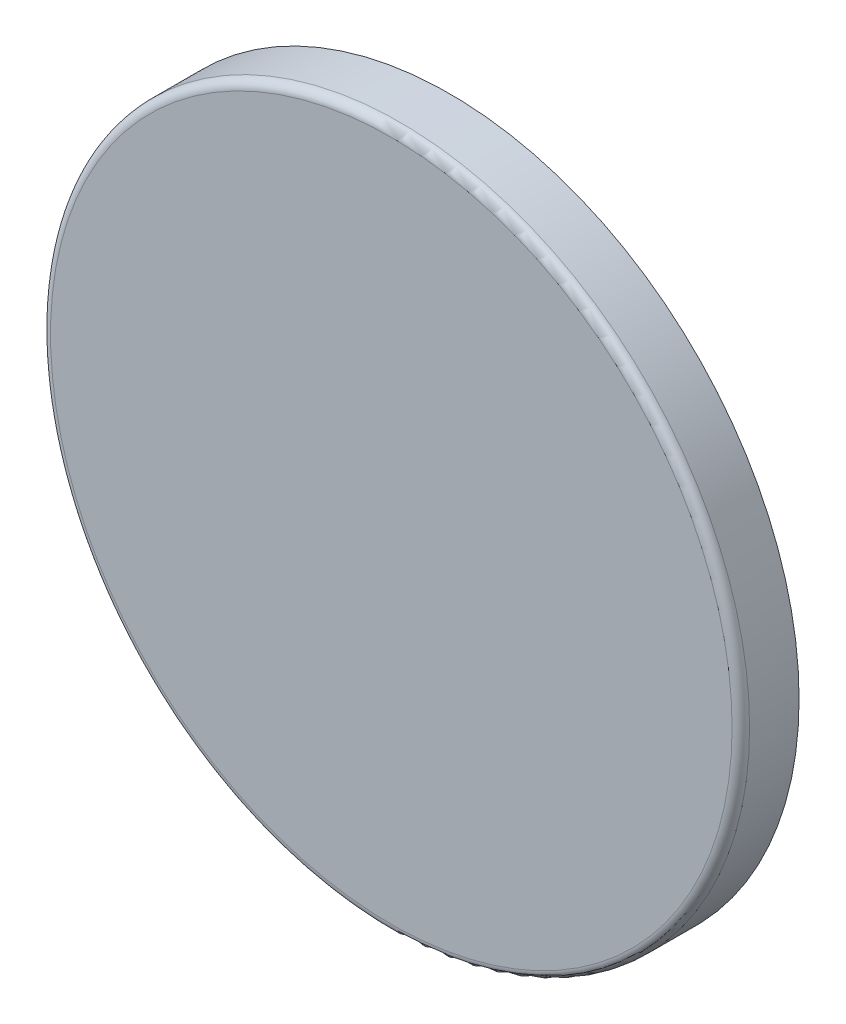
ISO-10303-21;
HEADER;
FILE_DESCRIPTION(('STEP AP214'),'2;1');
FILE_NAME('part.step','',(''),(''),'','','');
FILE_SCHEMA(('AUTOMOTIVE_DESIGN { 1 0 10303 214 1 1 1 1 }'));
ENDSEC;
DATA;
#1=APPLICATION_CONTEXT('core data for automotive mechanical design processes');
#2=APPLICATION_PROTOCOL_DEFINITION('international standard','automotive_design',2000,#1);
#3=PRODUCT_CONTEXT('',#1,'mechanical');
#4=PRODUCT('Part','Part','',(#3));
#5=PRODUCT_RELATED_PRODUCT_CATEGORY('part','',(#4));
#6=PRODUCT_DEFINITION_FORMATION('','',#4);
#7=PRODUCT_DEFINITION_CONTEXT('part definition',#1,'design');
#8=PRODUCT_DEFINITION('design','',#6,#7);
#9=PRODUCT_DEFINITION_SHAPE('','',#8);
#10=(LENGTH_UNIT() NAMED_UNIT(*) SI_UNIT(.MILLI.,.METRE.));
#11=(NAMED_UNIT(*) PLANE_ANGLE_UNIT() SI_UNIT($,.RADIAN.));
#12=(NAMED_UNIT(*) SI_UNIT($,.STERADIAN.) SOLID_ANGLE_UNIT());
#13=UNCERTAINTY_MEASURE_WITH_UNIT(LENGTH_MEASURE(1.E-05),#10,'distance_accuracy_value','');
#14=(GEOMETRIC_REPRESENTATION_CONTEXT(3) GLOBAL_UNCERTAINTY_ASSIGNED_CONTEXT((#13)) GLOBAL_UNIT_ASSIGNED_CONTEXT((#10,
#11,#12)) REPRESENTATION_CONTEXT('',''));
#15=CARTESIAN_POINT('',(0.,0.,0.));
#16=DIRECTION('',(0.,0.,1.));
#17=DIRECTION('',(1.,0.,0.));
#18=AXIS2_PLACEMENT_3D('',#15,#16,#17);
#19=CARTESIAN_POINT('',(0.,0.,1.));
#20=DIRECTION('',(0.,0.,-1.));
#21=DIRECTION('',(-1.,0.,0.));
#22=AXIS2_PLACEMENT_3D('',#19,#20,#21);
#23=CYLINDRICAL_SURFACE('',#22,6.);
#24=CARTESIAN_POINT('',(0.,0.,0.85));
#25=DIRECTION('',(0.,0.,1.));
#26=DIRECTION('',(1.,0.,0.));
#27=AXIS2_PLACEMENT_3D('',#24,#25,#26);
#28=CIRCLE('',#27,6.);
#29=CARTESIAN_POINT('',(6.,0.,0.85));
#30=VERTEX_POINT('',#29);
#31=EDGE_CURVE('E10',#30,#30,#28,.F.);
#32=ORIENTED_EDGE('',*,*,#31,.T.);
#33=EDGE_LOOP('',(#32));
#34=FACE_BOUND('',#33,.T.);
#35=CARTESIAN_POINT('',(0.,0.,0.));
#36=DIRECTION('',(0.,0.,1.));
#37=DIRECTION('',(1.,0.,0.));
#38=AXIS2_PLACEMENT_3D('',#35,#36,#37);
#39=CIRCLE('',#38,6.);
#40=CARTESIAN_POINT('',(6.,0.,0.));
#41=VERTEX_POINT('',#40);
#42=EDGE_CURVE('E50',#41,#41,#39,.T.);
#43=ORIENTED_EDGE('',*,*,#42,.T.);
#44=EDGE_LOOP('',(#43));
#45=FACE_BOUND('',#44,.T.);
#46=ADVANCED_FACE('F37',(#34,#45),#23,.T.);
#47=CARTESIAN_POINT('',(0.,0.,1.));
#48=DIRECTION('',(0.,0.,1.));
#49=DIRECTION('',(1.,0.,0.));
#50=AXIS2_PLACEMENT_3D('',#47,#48,#49);
#51=PLANE('',#50);
#52=CARTESIAN_POINT('',(0.,0.,1.));
#53=DIRECTION('',(0.,0.,1.));
#54=DIRECTION('',(1.,0.,0.));
#55=AXIS2_PLACEMENT_3D('',#52,#53,#54);
#56=CIRCLE('',#55,5.85);
#57=CARTESIAN_POINT('',(5.85,0.,1.));
#58=VERTEX_POINT('',#57);
#59=EDGE_CURVE('E45',#58,#58,#56,.T.);
#60=ORIENTED_EDGE('',*,*,#59,.T.);
#61=EDGE_LOOP('',(#60));
#62=FACE_BOUND('',#61,.T.);
#63=ADVANCED_FACE('F61',(#62),#51,.T.);
#64=CARTESIAN_POINT('',(0.,0.,0.));
#65=DIRECTION('',(0.,0.,1.));
#66=DIRECTION('',(1.,0.,0.));
#67=AXIS2_PLACEMENT_3D('',#64,#65,#66);
#68=PLANE('',#67);
#69=ORIENTED_EDGE('',*,*,#42,.F.);
#70=EDGE_LOOP('',(#69));
#71=FACE_BOUND('',#70,.T.);
#72=ADVANCED_FACE('F59',(#71),#68,.F.);
#73=CARTESIAN_POINT('',(0.,0.,0.85));
#74=DIRECTION('',(0.,0.,1.));
#75=DIRECTION('',(1.,0.,0.));
#76=AXIS2_PLACEMENT_3D('',#73,#74,#75);
#77=TOROIDAL_SURFACE('',#76,5.85,0.15);
#78=ORIENTED_EDGE('',*,*,#31,.F.);
#79=EDGE_LOOP('',(#78));
#80=FACE_BOUND('',#79,.T.);
#81=ORIENTED_EDGE('',*,*,#59,.F.);
#82=EDGE_LOOP('',(#81));
#83=FACE_BOUND('',#82,.T.);
#84=ADVANCED_FACE('F39',(#80,#83),#77,.T.);
#85=CLOSED_SHELL('',(#46,#63,#72,#84));
#86=MANIFOLD_SOLID_BREP('B2',#85);
#87=ADVANCED_BREP_SHAPE_REPRESENTATION('',(#18,#86),#14);
#88=SHAPE_DEFINITION_REPRESENTATION(#9,#87);
ENDSEC;
END-ISO-10303-21;
